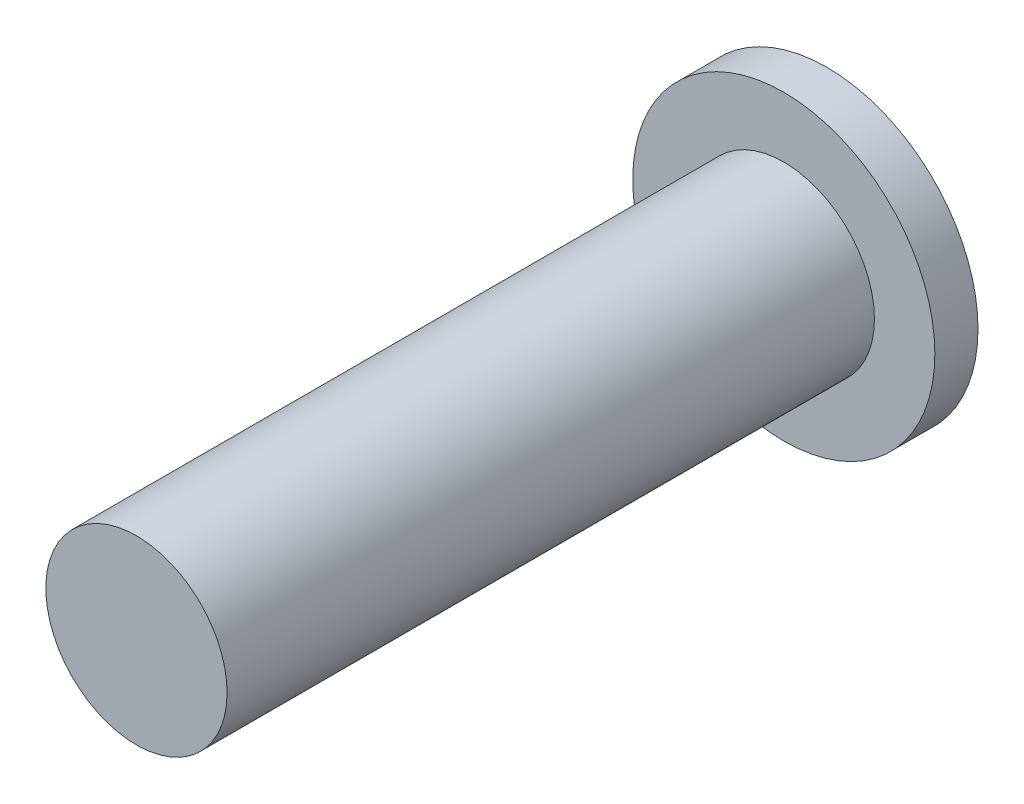
ISO-10303-21;
HEADER;
FILE_DESCRIPTION(('STEP AP214'),'2;1');
FILE_NAME('part.step','',(''),(''),'','','');
FILE_SCHEMA(('AUTOMOTIVE_DESIGN { 1 0 10303 214 1 1 1 1 }'));
ENDSEC;
DATA;
#1=APPLICATION_CONTEXT('core data for automotive mechanical design processes');
#2=APPLICATION_PROTOCOL_DEFINITION('international standard','automotive_design',2000,#1);
#3=PRODUCT_CONTEXT('',#1,'mechanical');
#4=PRODUCT('Part','Part','',(#3));
#5=PRODUCT_RELATED_PRODUCT_CATEGORY('part','',(#4));
#6=PRODUCT_DEFINITION_FORMATION('','',#4);
#7=PRODUCT_DEFINITION_CONTEXT('part definition',#1,'design');
#8=PRODUCT_DEFINITION('design','',#6,#7);
#9=PRODUCT_DEFINITION_SHAPE('','',#8);
#10=(LENGTH_UNIT() NAMED_UNIT(*) SI_UNIT(.MILLI.,.METRE.));
#11=(NAMED_UNIT(*) PLANE_ANGLE_UNIT() SI_UNIT($,.RADIAN.));
#12=(NAMED_UNIT(*) SI_UNIT($,.STERADIAN.) SOLID_ANGLE_UNIT());
#13=UNCERTAINTY_MEASURE_WITH_UNIT(LENGTH_MEASURE(1.E-05),#10,'distance_accuracy_value','');
#14=(GEOMETRIC_REPRESENTATION_CONTEXT(3) GLOBAL_UNCERTAINTY_ASSIGNED_CONTEXT((#13)) GLOBAL_UNIT_ASSIGNED_CONTEXT((#10,
#11,#12)) REPRESENTATION_CONTEXT('',''));
#15=CARTESIAN_POINT('',(0.,0.,0.));
#16=DIRECTION('',(0.,0.,1.));
#17=DIRECTION('',(1.,0.,0.));
#18=AXIS2_PLACEMENT_3D('',#15,#16,#17);
#19=CARTESIAN_POINT('',(0.,0.,30.));
#20=DIRECTION('',(0.,0.,-1.));
#21=DIRECTION('',(-1.,0.,0.));
#22=AXIS2_PLACEMENT_3D('',#19,#20,#21);
#23=CYLINDRICAL_SURFACE('',#22,4.2);
#24=CARTESIAN_POINT('',(0.,0.,30.));
#25=DIRECTION('',(0.,0.,1.));
#26=DIRECTION('',(1.,0.,0.));
#27=AXIS2_PLACEMENT_3D('',#24,#25,#26);
#28=CIRCLE('',#27,4.2);
#29=CARTESIAN_POINT('',(4.2,0.,30.));
#30=VERTEX_POINT('',#29);
#31=EDGE_CURVE('E10',#30,#30,#28,.T.);
#32=ORIENTED_EDGE('',*,*,#31,.F.);
#33=EDGE_LOOP('',(#32));
#34=FACE_BOUND('',#33,.T.);
#35=CARTESIAN_POINT('',(0.,0.,0.));
#36=DIRECTION('',(0.,0.,1.));
#37=DIRECTION('',(1.,0.,0.));
#38=AXIS2_PLACEMENT_3D('',#35,#36,#37);
#39=CIRCLE('',#38,4.2);
#40=CARTESIAN_POINT('',(4.2,0.,0.));
#41=VERTEX_POINT('',#40);
#42=EDGE_CURVE('E46',#41,#41,#39,.T.);
#43=ORIENTED_EDGE('',*,*,#42,.T.);
#44=EDGE_LOOP('',(#43));
#45=FACE_BOUND('',#44,.T.);
#46=ADVANCED_FACE('F43',(#34,#45),#23,.T.);
#47=CARTESIAN_POINT('',(0.,0.,30.));
#48=DIRECTION('',(0.,0.,1.));
#49=DIRECTION('',(1.,0.,0.));
#50=AXIS2_PLACEMENT_3D('',#47,#48,#49);
#51=PLANE('',#50);
#52=ORIENTED_EDGE('',*,*,#31,.T.);
#53=EDGE_LOOP('',(#52));
#54=FACE_BOUND('',#53,.T.);
#55=ADVANCED_FACE('F70',(#54),#51,.T.);
#56=CARTESIAN_POINT('',(0.,0.,-2.));
#57=DIRECTION('',(0.,0.,1.));
#58=DIRECTION('',(1.,0.,0.));
#59=AXIS2_PLACEMENT_3D('',#56,#57,#58);
#60=CYLINDRICAL_SURFACE('',#59,7.);
#61=CARTESIAN_POINT('',(0.,0.,-2.));
#62=DIRECTION('',(0.,0.,-1.));
#63=DIRECTION('',(-1.,0.,0.));
#64=AXIS2_PLACEMENT_3D('',#61,#62,#63);
#65=CIRCLE('',#64,7.);
#66=CARTESIAN_POINT('',(-7.,0.,-2.));
#67=VERTEX_POINT('',#66);
#68=EDGE_CURVE('E55',#67,#67,#65,.T.);
#69=ORIENTED_EDGE('',*,*,#68,.F.);
#70=EDGE_LOOP('',(#69));
#71=FACE_BOUND('',#70,.T.);
#72=CARTESIAN_POINT('',(0.,0.,0.));
#73=DIRECTION('',(0.,0.,-1.));
#74=DIRECTION('',(-1.,0.,0.));
#75=AXIS2_PLACEMENT_3D('',#72,#73,#74);
#76=CIRCLE('',#75,7.);
#77=CARTESIAN_POINT('',(-7.,0.,0.));
#78=VERTEX_POINT('',#77);
#79=EDGE_CURVE('E57',#78,#78,#76,.T.);
#80=ORIENTED_EDGE('',*,*,#79,.T.);
#81=EDGE_LOOP('',(#80));
#82=FACE_BOUND('',#81,.T.);
#83=ADVANCED_FACE('F67',(#71,#82),#60,.T.);
#84=CARTESIAN_POINT('',(0.,0.,-2.));
#85=DIRECTION('',(0.,0.,-1.));
#86=DIRECTION('',(-1.,0.,0.));
#87=AXIS2_PLACEMENT_3D('',#84,#85,#86);
#88=PLANE('',#87);
#89=ORIENTED_EDGE('',*,*,#68,.T.);
#90=EDGE_LOOP('',(#89));
#91=FACE_BOUND('',#90,.T.);
#92=ADVANCED_FACE('F65',(#91),#88,.T.);
#93=CARTESIAN_POINT('',(0.,0.,0.));
#94=DIRECTION('',(0.,0.,-1.));
#95=DIRECTION('',(-1.,0.,0.));
#96=AXIS2_PLACEMENT_3D('',#93,#94,#95);
#97=PLANE('',#96);
#98=ORIENTED_EDGE('',*,*,#42,.F.);
#99=EDGE_LOOP('',(#98));
#100=FACE_BOUND('',#99,.T.);
#101=ORIENTED_EDGE('',*,*,#79,.F.);
#102=EDGE_LOOP('',(#101));
#103=FACE_BOUND('',#102,.T.);
#104=ADVANCED_FACE('F74',(#100,#103),#97,.F.);
#105=CLOSED_SHELL('',(#46,#55,#83,#92,#104));
#106=MANIFOLD_SOLID_BREP('B2',#105);
#107=ADVANCED_BREP_SHAPE_REPRESENTATION('',(#18,#106),#14);
#108=SHAPE_DEFINITION_REPRESENTATION(#9,#107);
ENDSEC;
END-ISO-10303-21;
